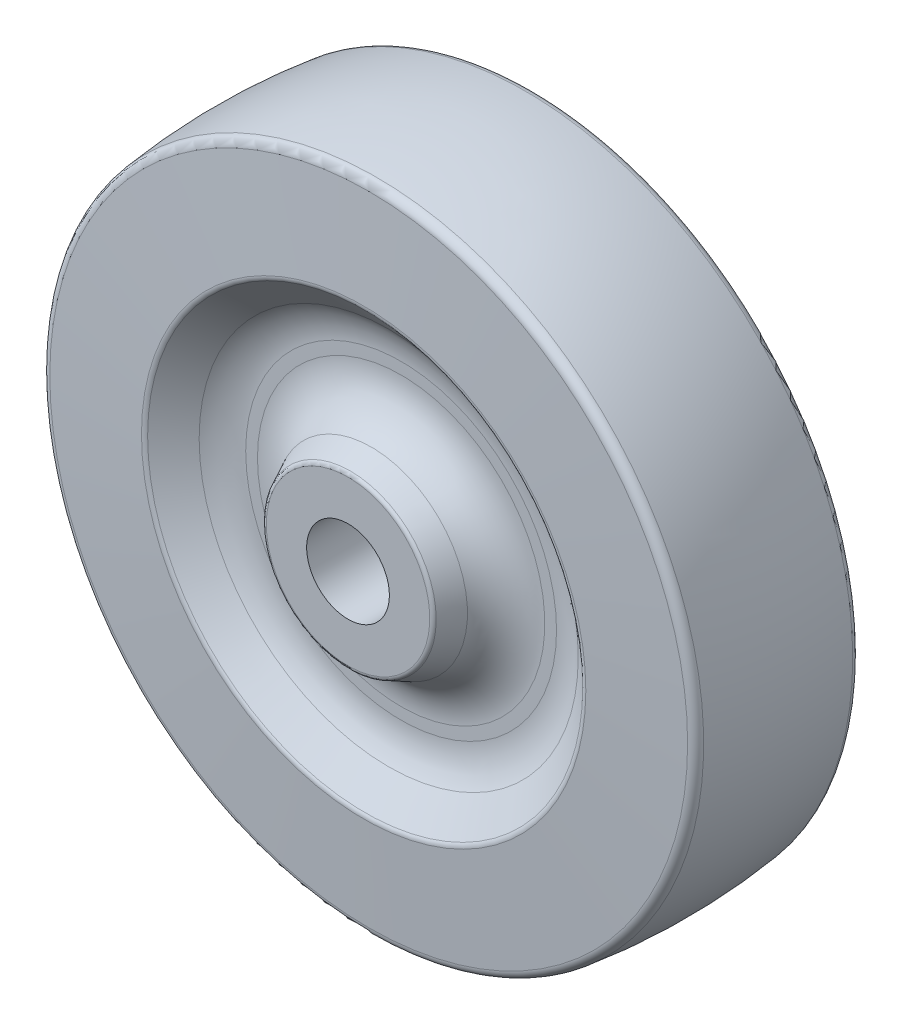
ISO-10303-21;
HEADER;
FILE_DESCRIPTION(('STEP AP214'),'2;1');
FILE_NAME('part.step','',(''),(''),'','','');
FILE_SCHEMA(('AUTOMOTIVE_DESIGN { 1 0 10303 214 1 1 1 1 }'));
ENDSEC;
DATA;
#1=APPLICATION_CONTEXT('core data for automotive mechanical design processes');
#2=APPLICATION_PROTOCOL_DEFINITION('international standard','automotive_design',2000,#1);
#3=PRODUCT_CONTEXT('',#1,'mechanical');
#4=PRODUCT('Part','Part','',(#3));
#5=PRODUCT_RELATED_PRODUCT_CATEGORY('part','',(#4));
#6=PRODUCT_DEFINITION_FORMATION('','',#4);
#7=PRODUCT_DEFINITION_CONTEXT('part definition',#1,'design');
#8=PRODUCT_DEFINITION('design','',#6,#7);
#9=PRODUCT_DEFINITION_SHAPE('','',#8);
#10=(LENGTH_UNIT() NAMED_UNIT(*) SI_UNIT(.MILLI.,.METRE.));
#11=(NAMED_UNIT(*) PLANE_ANGLE_UNIT() SI_UNIT($,.RADIAN.));
#12=(NAMED_UNIT(*) SI_UNIT($,.STERADIAN.) SOLID_ANGLE_UNIT());
#13=UNCERTAINTY_MEASURE_WITH_UNIT(LENGTH_MEASURE(1.E-05),#10,'distance_accuracy_value','');
#14=(GEOMETRIC_REPRESENTATION_CONTEXT(3) GLOBAL_UNCERTAINTY_ASSIGNED_CONTEXT((#13)) GLOBAL_UNIT_ASSIGNED_CONTEXT((#10,
#11,#12)) REPRESENTATION_CONTEXT('',''));
#15=CARTESIAN_POINT('',(0.,0.,0.));
#16=DIRECTION('',(0.,0.,1.));
#17=DIRECTION('',(1.,0.,0.));
#18=AXIS2_PLACEMENT_3D('',#15,#16,#17);
#19=CARTESIAN_POINT('',(0.,9.7028,11.8237));
#20=DIRECTION('',(0.,0.,-1.));
#21=DIRECTION('',(-1.,0.,0.));
#22=AXIS2_PLACEMENT_3D('',#19,#20,#21);
#23=PLANE('',#22);
#24=CARTESIAN_POINT('',(0.,0.,11.8237));
#25=DIRECTION('',(0.,0.,-1.));
#26=DIRECTION('',(-1.,0.,0.));
#27=AXIS2_PLACEMENT_3D('',#24,#25,#26);
#28=CIRCLE('',#27,9.38648594117093);
#29=CARTESIAN_POINT('',(-9.38648594117093,0.,11.8237));
#30=VERTEX_POINT('',#29);
#31=EDGE_CURVE('E47',#30,#30,#28,.F.);
#32=ORIENTED_EDGE('',*,*,#31,.T.);
#33=EDGE_LOOP('',(#32));
#34=FACE_BOUND('',#33,.T.);
#35=CARTESIAN_POINT('',(0.,0.,11.8237));
#36=DIRECTION('',(0.,0.,1.));
#37=DIRECTION('',(1.,0.,0.));
#38=AXIS2_PLACEMENT_3D('',#35,#36,#37);
#39=CIRCLE('',#38,4.7498);
#40=CARTESIAN_POINT('',(4.7498,0.,11.8237));
#41=VERTEX_POINT('',#40);
#42=EDGE_CURVE('E100',#41,#41,#39,.T.);
#43=ORIENTED_EDGE('',*,*,#42,.F.);
#44=EDGE_LOOP('',(#43));
#45=FACE_BOUND('',#44,.T.);
#46=ADVANCED_FACE('F32',(#34,#45),#23,.F.);
#47=CARTESIAN_POINT('',(0.,0.,5.7277));
#48=DIRECTION('',(0.,0.,-1.));
#49=DIRECTION('',(-1.,0.,0.));
#50=AXIS2_PLACEMENT_3D('',#47,#48,#49);
#51=CONICAL_SURFACE('',#50,12.7,0.456958745547133);
#52=CARTESIAN_POINT('',(0.,0.,11.539840234691));
#53=DIRECTION('',(0.,0.,1.));
#54=DIRECTION('',(1.,0.,0.));
#55=AXIS2_PLACEMENT_3D('',#52,#53,#54);
#56=CIRCLE('',#55,9.84236438461026);
#57=CARTESIAN_POINT('',(9.84236438461026,0.,11.539840234691));
#58=VERTEX_POINT('',#57);
#59=EDGE_CURVE('E43',#58,#58,#56,.F.);
#60=ORIENTED_EDGE('',*,*,#59,.T.);
#61=EDGE_LOOP('',(#60));
#62=FACE_BOUND('',#61,.T.);
#63=CARTESIAN_POINT('',(0.,0.,9.13401718370798));
#64=DIRECTION('',(0.,0.,-1.));
#65=DIRECTION('',(-1.,0.,0.));
#66=AXIS2_PLACEMENT_3D('',#63,#64,#65);
#67=CIRCLE('',#66,11.0252273846769);
#68=CARTESIAN_POINT('',(-11.0252273846769,0.,9.13401718370798));
#69=VERTEX_POINT('',#68);
#70=EDGE_CURVE('E85',#69,#69,#67,.F.);
#71=ORIENTED_EDGE('',*,*,#70,.T.);
#72=EDGE_LOOP('',(#71));
#73=FACE_BOUND('',#72,.T.);
#74=ADVANCED_FACE('F124',(#62,#73),#51,.T.);
#75=CARTESIAN_POINT('',(0.,20.066,5.7277));
#76=DIRECTION('',(0.,0.,-1.));
#77=DIRECTION('',(-1.,0.,0.));
#78=AXIS2_PLACEMENT_3D('',#75,#76,#77);
#79=PLANE('',#78);
#80=CARTESIAN_POINT('',(0.,0.,5.7277));
#81=DIRECTION('',(0.,0.,-1.));
#82=DIRECTION('',(-1.,0.,0.));
#83=AXIS2_PLACEMENT_3D('',#80,#81,#82);
#84=CIRCLE('',#83,16.4957687059488);
#85=CARTESIAN_POINT('',(-16.4957687059488,0.,5.7277));
#86=VERTEX_POINT('',#85);
#87=EDGE_CURVE('E79',#86,#86,#84,.T.);
#88=ORIENTED_EDGE('',*,*,#87,.T.);
#89=EDGE_LOOP('',(#88));
#90=FACE_BOUND('',#89,.T.);
#91=CARTESIAN_POINT('',(0.,0.,5.7277));
#92=DIRECTION('',(0.,0.,-1.));
#93=DIRECTION('',(-1.,0.,0.));
#94=AXIS2_PLACEMENT_3D('',#91,#92,#93);
#95=CIRCLE('',#94,17.8472374519132);
#96=CARTESIAN_POINT('',(-17.8472374519132,0.,5.7277));
#97=VERTEX_POINT('',#96);
#98=EDGE_CURVE('E82',#97,#97,#95,.F.);
#99=ORIENTED_EDGE('',*,*,#98,.T.);
#100=EDGE_LOOP('',(#99));
#101=FACE_BOUND('',#100,.T.);
#102=ADVANCED_FACE('F130',(#90,#101),#79,.F.);
#103=CARTESIAN_POINT('',(0.,0.,10.0457));
#104=DIRECTION('',(0.,0.,1.));
#105=DIRECTION('',(1.,0.,0.));
#106=AXIS2_PLACEMENT_3D('',#103,#104,#105);
#107=CONICAL_SURFACE('',#106,25.2119920128217,0.872664625997159);
#108=CARTESIAN_POINT('',(0.,0.,9.85276101093513));
#109=DIRECTION('',(0.,0.,-1.));
#110=DIRECTION('',(-1.,0.,0.));
#111=AXIS2_PLACEMENT_3D('',#108,#109,#110);
#112=CIRCLE('',#111,24.9820562794522);
#113=CARTESIAN_POINT('',(-24.9820562794522,0.,9.85276101093513));
#114=VERTEX_POINT('',#113);
#115=EDGE_CURVE('E61',#114,#114,#112,.F.);
#116=ORIENTED_EDGE('',*,*,#115,.T.);
#117=EDGE_LOOP('',(#116));
#118=FACE_BOUND('',#117,.T.);
#119=CARTESIAN_POINT('',(0.,0.,7.15389307474673));
#120=DIRECTION('',(0.,0.,1.));
#121=DIRECTION('',(1.,0.,0.));
#122=AXIS2_PLACEMENT_3D('',#119,#120,#121);
#123=CIRCLE('',#122,21.7656707205624);
#124=CARTESIAN_POINT('',(21.7656707205624,0.,7.15389307474673));
#125=VERTEX_POINT('',#124);
#126=EDGE_CURVE('E76',#125,#125,#123,.F.);
#127=ORIENTED_EDGE('',*,*,#126,.T.);
#128=EDGE_LOOP('',(#127));
#129=FACE_BOUND('',#128,.T.);
#130=ADVANCED_FACE('F258',(#118,#129),#107,.F.);
#131=CARTESIAN_POINT('',(0.,0.,9.40359297940193));
#132=DIRECTION('',(0.,0.,-1.));
#133=DIRECTION('',(-1.,0.,0.));
#134=AXIS2_PLACEMENT_3D('',#131,#132,#133);
#135=CONICAL_SURFACE('',#134,37.4641238410033,1.51843644923507);
#136=CARTESIAN_POINT('',(0.,0.,10.0299908507615));
#137=DIRECTION('',(0.,0.,1.));
#138=DIRECTION('',(1.,0.,0.));
#139=AXIS2_PLACEMENT_3D('',#136,#137,#138);
#140=CIRCLE('',#139,25.5117404366905);
#141=CARTESIAN_POINT('',(25.5117404366905,0.,10.0299908507615));
#142=VERTEX_POINT('',#141);
#143=EDGE_CURVE('E58',#142,#142,#140,.F.);
#144=ORIENTED_EDGE('',*,*,#143,.T.);
#145=EDGE_LOOP('',(#144));
#146=FACE_BOUND('',#145,.T.);
#147=CARTESIAN_POINT('',(0.,0.,9.44790441551916));
#148=DIRECTION('',(0.,0.,1.));
#149=DIRECTION('',(1.,0.,0.));
#150=AXIS2_PLACEMENT_3D('',#147,#148,#149);
#151=CIRCLE('',#150,36.6186112716209);
#152=CARTESIAN_POINT('',(36.6186112716209,0.,9.44790441551916));
#153=VERTEX_POINT('',#152);
#154=EDGE_CURVE('E97',#153,#153,#151,.T.);
#155=ORIENTED_EDGE('',*,*,#154,.T.);
#156=EDGE_LOOP('',(#155));
#157=FACE_BOUND('',#156,.T.);
#158=ADVANCED_FACE('F253',(#146,#157),#135,.T.);
#159=CARTESIAN_POINT('',(0.,0.,0.));
#160=DIRECTION('',(0.,0.,1.));
#161=DIRECTION('',(1.,0.,0.));
#162=AXIS2_PLACEMENT_3D('',#159,#160,#161);
#163=DEGENERATE_TOROIDAL_SURFACE('',#162,31.75,69.85,.F.);
#164=CARTESIAN_POINT('',(0.,0.,8.55777351386473));
#165=DIRECTION('',(0.,0.,-1.));
#166=DIRECTION('',(-1.,0.,0.));
#167=AXIS2_PLACEMENT_3D('',#164,#165,#166);
#168=CIRCLE('',#167,37.5737838875331);
#169=CARTESIAN_POINT('',(-37.5737838875331,0.,8.55777351386473));
#170=VERTEX_POINT('',#169);
#171=EDGE_CURVE('E91',#170,#170,#168,.T.);
#172=ORIENTED_EDGE('',*,*,#171,.T.);
#173=EDGE_LOOP('',(#172));
#174=FACE_BOUND('',#173,.T.);
#175=CARTESIAN_POINT('',(0.,0.,-8.55777351386473));
#176=DIRECTION('',(0.,0.,1.));
#177=DIRECTION('',(1.,0.,0.));
#178=AXIS2_PLACEMENT_3D('',#175,#176,#177);
#179=CIRCLE('',#178,37.5737838875331);
#180=CARTESIAN_POINT('',(37.5737838875331,0.,-8.55777351386473));
#181=VERTEX_POINT('',#180);
#182=EDGE_CURVE('E94',#181,#181,#179,.T.);
#183=ORIENTED_EDGE('',*,*,#182,.T.);
#184=EDGE_LOOP('',(#183));
#185=FACE_BOUND('',#184,.T.);
#186=ADVANCED_FACE('F245',(#174,#185),#163,.F.);
#187=CARTESIAN_POINT('',(0.,0.,-10.0457));
#188=DIRECTION('',(0.,0.,1.));
#189=DIRECTION('',(1.,0.,0.));
#190=AXIS2_PLACEMENT_3D('',#187,#188,#189);
#191=CONICAL_SURFACE('',#190,25.2119920128217,1.51843644923507);
#192=CARTESIAN_POINT('',(0.,0.,-10.0299908507614));
#193=DIRECTION('',(0.,0.,-1.));
#194=DIRECTION('',(-1.,0.,0.));
#195=AXIS2_PLACEMENT_3D('',#192,#193,#194);
#196=CIRCLE('',#195,25.5117404366905);
#197=CARTESIAN_POINT('',(-25.5117404366905,0.,-10.0299908507614));
#198=VERTEX_POINT('',#197);
#199=EDGE_CURVE('E55',#198,#198,#196,.F.);
#200=ORIENTED_EDGE('',*,*,#199,.T.);
#201=EDGE_LOOP('',(#200));
#202=FACE_BOUND('',#201,.T.);
#203=CARTESIAN_POINT('',(0.,0.,-9.44790441551917));
#204=DIRECTION('',(0.,0.,-1.));
#205=DIRECTION('',(-1.,0.,0.));
#206=AXIS2_PLACEMENT_3D('',#203,#204,#205);
#207=CIRCLE('',#206,36.6186112716209);
#208=CARTESIAN_POINT('',(-36.6186112716209,0.,-9.44790441551917));
#209=VERTEX_POINT('',#208);
#210=EDGE_CURVE('E88',#209,#209,#207,.T.);
#211=ORIENTED_EDGE('',*,*,#210,.T.);
#212=EDGE_LOOP('',(#211));
#213=FACE_BOUND('',#212,.T.);
#214=ADVANCED_FACE('F235',(#202,#213),#191,.T.);
#215=CARTESIAN_POINT('',(0.,0.,-5.7277));
#216=DIRECTION('',(0.,0.,-1.));
#217=DIRECTION('',(-1.,0.,0.));
#218=AXIS2_PLACEMENT_3D('',#215,#216,#217);
#219=CONICAL_SURFACE('',#218,20.066,0.87266462599716);
#220=CARTESIAN_POINT('',(0.,0.,-9.85276101093512));
#221=DIRECTION('',(0.,0.,1.));
#222=DIRECTION('',(1.,0.,0.));
#223=AXIS2_PLACEMENT_3D('',#220,#221,#222);
#224=CIRCLE('',#223,24.9820562794522);
#225=CARTESIAN_POINT('',(24.9820562794522,0.,-9.85276101093512));
#226=VERTEX_POINT('',#225);
#227=EDGE_CURVE('E52',#226,#226,#224,.F.);
#228=ORIENTED_EDGE('',*,*,#227,.T.);
#229=EDGE_LOOP('',(#228));
#230=FACE_BOUND('',#229,.T.);
#231=CARTESIAN_POINT('',(0.,0.,-7.15389307474672));
#232=DIRECTION('',(0.,0.,-1.));
#233=DIRECTION('',(-1.,0.,0.));
#234=AXIS2_PLACEMENT_3D('',#231,#232,#233);
#235=CIRCLE('',#234,21.7656707205624);
#236=CARTESIAN_POINT('',(-21.7656707205624,0.,-7.15389307474672));
#237=VERTEX_POINT('',#236);
#238=EDGE_CURVE('E64',#237,#237,#235,.F.);
#239=ORIENTED_EDGE('',*,*,#238,.T.);
#240=EDGE_LOOP('',(#239));
#241=FACE_BOUND('',#240,.T.);
#242=ADVANCED_FACE('F230',(#230,#241),#219,.F.);
#243=CARTESIAN_POINT('',(0.,20.066,-5.7277));
#244=DIRECTION('',(0.,0.,1.));
#245=DIRECTION('',(1.,0.,0.));
#246=AXIS2_PLACEMENT_3D('',#243,#244,#245);
#247=PLANE('',#246);
#248=CARTESIAN_POINT('',(0.,0.,-5.7277));
#249=DIRECTION('',(0.,0.,1.));
#250=DIRECTION('',(1.,0.,0.));
#251=AXIS2_PLACEMENT_3D('',#248,#249,#250);
#252=CIRCLE('',#251,16.4957687059488);
#253=CARTESIAN_POINT('',(16.4957687059488,0.,-5.7277));
#254=VERTEX_POINT('',#253);
#255=EDGE_CURVE('E70',#254,#254,#252,.T.);
#256=ORIENTED_EDGE('',*,*,#255,.T.);
#257=EDGE_LOOP('',(#256));
#258=FACE_BOUND('',#257,.T.);
#259=CARTESIAN_POINT('',(0.,0.,-5.7277));
#260=DIRECTION('',(0.,0.,1.));
#261=DIRECTION('',(1.,0.,0.));
#262=AXIS2_PLACEMENT_3D('',#259,#260,#261);
#263=CIRCLE('',#262,17.8472374519132);
#264=CARTESIAN_POINT('',(17.8472374519132,0.,-5.7277));
#265=VERTEX_POINT('',#264);
#266=EDGE_CURVE('E73',#265,#265,#263,.F.);
#267=ORIENTED_EDGE('',*,*,#266,.T.);
#268=EDGE_LOOP('',(#267));
#269=FACE_BOUND('',#268,.T.);
#270=ADVANCED_FACE('F199',(#258,#269),#247,.F.);
#271=CARTESIAN_POINT('',(0.,0.,-11.8237));
#272=DIRECTION('',(0.,0.,1.));
#273=DIRECTION('',(1.,0.,0.));
#274=AXIS2_PLACEMENT_3D('',#271,#272,#273);
#275=CONICAL_SURFACE('',#274,9.7028,0.456958745547133);
#276=CARTESIAN_POINT('',(0.,0.,-11.539840234691));
#277=DIRECTION('',(0.,0.,-1.));
#278=DIRECTION('',(-1.,0.,0.));
#279=AXIS2_PLACEMENT_3D('',#276,#277,#278);
#280=CIRCLE('',#279,9.84236438461026);
#281=CARTESIAN_POINT('',(-9.84236438461026,0.,-11.539840234691));
#282=VERTEX_POINT('',#281);
#283=EDGE_CURVE('E39',#282,#282,#280,.F.);
#284=ORIENTED_EDGE('',*,*,#283,.T.);
#285=EDGE_LOOP('',(#284));
#286=FACE_BOUND('',#285,.T.);
#287=CARTESIAN_POINT('',(0.,0.,-9.13401718370798));
#288=DIRECTION('',(0.,0.,1.));
#289=DIRECTION('',(1.,0.,0.));
#290=AXIS2_PLACEMENT_3D('',#287,#288,#289);
#291=CIRCLE('',#290,11.0252273846769);
#292=CARTESIAN_POINT('',(11.0252273846769,0.,-9.13401718370798));
#293=VERTEX_POINT('',#292);
#294=EDGE_CURVE('E67',#293,#293,#291,.F.);
#295=ORIENTED_EDGE('',*,*,#294,.T.);
#296=EDGE_LOOP('',(#295));
#297=FACE_BOUND('',#296,.T.);
#298=ADVANCED_FACE('F121',(#286,#297),#275,.T.);
#299=CARTESIAN_POINT('',(0.,9.7028,-11.8237));
#300=DIRECTION('',(0.,0.,1.));
#301=DIRECTION('',(1.,0.,0.));
#302=AXIS2_PLACEMENT_3D('',#299,#300,#301);
#303=PLANE('',#302);
#304=CARTESIAN_POINT('',(0.,0.,-11.8237));
#305=DIRECTION('',(0.,0.,1.));
#306=DIRECTION('',(1.,0.,0.));
#307=AXIS2_PLACEMENT_3D('',#304,#305,#306);
#308=CIRCLE('',#307,9.38648594117093);
#309=CARTESIAN_POINT('',(9.38648594117093,0.,-11.8237));
#310=VERTEX_POINT('',#309);
#311=EDGE_CURVE('E10',#310,#310,#308,.F.);
#312=ORIENTED_EDGE('',*,*,#311,.T.);
#313=EDGE_LOOP('',(#312));
#314=FACE_BOUND('',#313,.T.);
#315=CARTESIAN_POINT('',(0.,0.,-11.8237));
#316=DIRECTION('',(0.,0.,1.));
#317=DIRECTION('',(1.,0.,0.));
#318=AXIS2_PLACEMENT_3D('',#315,#316,#317);
#319=CIRCLE('',#318,4.7498);
#320=CARTESIAN_POINT('',(4.7498,0.,-11.8237));
#321=VERTEX_POINT('',#320);
#322=EDGE_CURVE('E103',#321,#321,#319,.T.);
#323=ORIENTED_EDGE('',*,*,#322,.T.);
#324=EDGE_LOOP('',(#323));
#325=FACE_BOUND('',#324,.T.);
#326=ADVANCED_FACE('F107',(#314,#325),#303,.F.);
#327=CARTESIAN_POINT('',(0.,0.,11.8237));
#328=DIRECTION('',(0.,0.,1.));
#329=DIRECTION('',(1.,0.,0.));
#330=AXIS2_PLACEMENT_3D('',#327,#328,#329);
#331=CYLINDRICAL_SURFACE('',#330,4.7498);
#332=ORIENTED_EDGE('',*,*,#42,.T.);
#333=EDGE_LOOP('',(#332));
#334=FACE_BOUND('',#333,.T.);
#335=ORIENTED_EDGE('',*,*,#322,.F.);
#336=EDGE_LOOP('',(#335));
#337=FACE_BOUND('',#336,.T.);
#338=ADVANCED_FACE('F109',(#334,#337),#331,.F.);
#339=CARTESIAN_POINT('',(0.,0.,8.43329680820851));
#340=DIRECTION('',(0.,0.,-1.));
#341=DIRECTION('',(-1.,0.,0.));
#342=AXIS2_PLACEMENT_3D('',#339,#340,#341);
#343=TOROIDAL_SURFACE('',#342,36.5654379400781,1.016);
#344=ORIENTED_EDGE('',*,*,#171,.F.);
#345=EDGE_LOOP('',(#344));
#346=FACE_BOUND('',#345,.T.);
#347=ORIENTED_EDGE('',*,*,#154,.F.);
#348=EDGE_LOOP('',(#347));
#349=FACE_BOUND('',#348,.T.);
#350=ADVANCED_FACE('F111',(#346,#349),#343,.T.);
#351=CARTESIAN_POINT('',(0.,0.,-8.43329680820852));
#352=DIRECTION('',(0.,0.,-1.));
#353=DIRECTION('',(-1.,0.,0.));
#354=AXIS2_PLACEMENT_3D('',#351,#352,#353);
#355=TOROIDAL_SURFACE('',#354,36.5654379400781,1.016);
#356=ORIENTED_EDGE('',*,*,#210,.F.);
#357=EDGE_LOOP('',(#356));
#358=FACE_BOUND('',#357,.T.);
#359=ORIENTED_EDGE('',*,*,#182,.F.);
#360=EDGE_LOOP('',(#359));
#361=FACE_BOUND('',#360,.T.);
#362=ADVANCED_FACE('F118',(#358,#361),#355,.T.);
#363=CARTESIAN_POINT('',(0.,0.,11.8237));
#364=DIRECTION('',(0.,0.,-1.));
#365=DIRECTION('',(-1.,0.,0.));
#366=AXIS2_PLACEMENT_3D('',#363,#364,#365);
#367=TOROIDAL_SURFACE('',#366,16.4957687059488,6.096);
#368=ORIENTED_EDGE('',*,*,#87,.F.);
#369=EDGE_LOOP('',(#368));
#370=FACE_BOUND('',#369,.T.);
#371=ORIENTED_EDGE('',*,*,#70,.F.);
#372=EDGE_LOOP('',(#371));
#373=FACE_BOUND('',#372,.T.);
#374=ADVANCED_FACE('F138',(#370,#373),#367,.F.);
#375=CARTESIAN_POINT('',(0.,0.,11.8237));
#376=DIRECTION('',(0.,0.,-1.));
#377=DIRECTION('',(-1.,0.,0.));
#378=AXIS2_PLACEMENT_3D('',#375,#376,#377);
#379=TOROIDAL_SURFACE('',#378,17.8472374519132,6.096);
#380=ORIENTED_EDGE('',*,*,#126,.F.);
#381=EDGE_LOOP('',(#380));
#382=FACE_BOUND('',#381,.T.);
#383=ORIENTED_EDGE('',*,*,#98,.F.);
#384=EDGE_LOOP('',(#383));
#385=FACE_BOUND('',#384,.T.);
#386=ADVANCED_FACE('F142',(#382,#385),#379,.F.);
#387=CARTESIAN_POINT('',(0.,0.,-11.8237));
#388=DIRECTION('',(0.,0.,1.));
#389=DIRECTION('',(1.,0.,0.));
#390=AXIS2_PLACEMENT_3D('',#387,#388,#389);
#391=TOROIDAL_SURFACE('',#390,16.4957687059488,6.096);
#392=ORIENTED_EDGE('',*,*,#294,.F.);
#393=EDGE_LOOP('',(#392));
#394=FACE_BOUND('',#393,.T.);
#395=ORIENTED_EDGE('',*,*,#255,.F.);
#396=EDGE_LOOP('',(#395));
#397=FACE_BOUND('',#396,.T.);
#398=ADVANCED_FACE('F146',(#394,#397),#391,.F.);
#399=CARTESIAN_POINT('',(0.,0.,-11.8237));
#400=DIRECTION('',(0.,0.,1.));
#401=DIRECTION('',(1.,0.,0.));
#402=AXIS2_PLACEMENT_3D('',#399,#400,#401);
#403=TOROIDAL_SURFACE('',#402,17.8472374519132,6.096);
#404=ORIENTED_EDGE('',*,*,#266,.F.);
#405=EDGE_LOOP('',(#404));
#406=FACE_BOUND('',#405,.T.);
#407=ORIENTED_EDGE('',*,*,#238,.F.);
#408=EDGE_LOOP('',(#407));
#409=FACE_BOUND('',#408,.T.);
#410=ADVANCED_FACE('F150',(#406,#409),#403,.F.);
#411=CARTESIAN_POINT('',(0.,0.,9.26903514527847));
#412=DIRECTION('',(0.,0.,-1.));
#413=DIRECTION('',(-1.,0.,0.));
#414=AXIS2_PLACEMENT_3D('',#411,#412,#413);
#415=TOROIDAL_SURFACE('',#414,25.4718604380333,0.762);
#416=ORIENTED_EDGE('',*,*,#143,.F.);
#417=EDGE_LOOP('',(#416));
#418=FACE_BOUND('',#417,.T.);
#419=ORIENTED_EDGE('',*,*,#115,.F.);
#420=EDGE_LOOP('',(#419));
#421=FACE_BOUND('',#420,.T.);
#422=ADVANCED_FACE('F154',(#418,#421),#415,.T.);
#423=CARTESIAN_POINT('',(0.,0.,-9.26903514527846));
#424=DIRECTION('',(0.,0.,-1.));
#425=DIRECTION('',(-1.,0.,0.));
#426=AXIS2_PLACEMENT_3D('',#423,#424,#425);
#427=TOROIDAL_SURFACE('',#426,25.4718604380333,0.762);
#428=ORIENTED_EDGE('',*,*,#227,.F.);
#429=EDGE_LOOP('',(#428));
#430=FACE_BOUND('',#429,.T.);
#431=ORIENTED_EDGE('',*,*,#199,.F.);
#432=EDGE_LOOP('',(#431));
#433=FACE_BOUND('',#432,.T.);
#434=ADVANCED_FACE('F158',(#430,#433),#427,.T.);
#435=CARTESIAN_POINT('',(0.,0.,11.3157));
#436=DIRECTION('',(0.,0.,-1.));
#437=DIRECTION('',(-1.,0.,0.));
#438=AXIS2_PLACEMENT_3D('',#435,#436,#437);
#439=TOROIDAL_SURFACE('',#438,9.38648594117093,0.508);
#440=ORIENTED_EDGE('',*,*,#59,.F.);
#441=EDGE_LOOP('',(#440));
#442=FACE_BOUND('',#441,.T.);
#443=ORIENTED_EDGE('',*,*,#31,.F.);
#444=EDGE_LOOP('',(#443));
#445=FACE_BOUND('',#444,.T.);
#446=ADVANCED_FACE('F161',(#442,#445),#439,.T.);
#447=CARTESIAN_POINT('',(0.,0.,-11.3157));
#448=DIRECTION('',(0.,0.,1.));
#449=DIRECTION('',(1.,0.,0.));
#450=AXIS2_PLACEMENT_3D('',#447,#448,#449);
#451=TOROIDAL_SURFACE('',#450,9.38648594117093,0.508);
#452=ORIENTED_EDGE('',*,*,#311,.F.);
#453=EDGE_LOOP('',(#452));
#454=FACE_BOUND('',#453,.T.);
#455=ORIENTED_EDGE('',*,*,#283,.F.);
#456=EDGE_LOOP('',(#455));
#457=FACE_BOUND('',#456,.T.);
#458=ADVANCED_FACE('F34',(#454,#457),#451,.T.);
#459=CLOSED_SHELL('',(#46,#74,#102,#130,#158,#186,#214,#242,#270,#298,#326,#338,#350,#362,#374,
#386,#398,#410,#422,#434,#446,#458));
#460=MANIFOLD_SOLID_BREP('B2',#459);
#461=ADVANCED_BREP_SHAPE_REPRESENTATION('',(#18,#460),#14);
#462=SHAPE_DEFINITION_REPRESENTATION(#9,#461);
ENDSEC;
END-ISO-10303-21;
